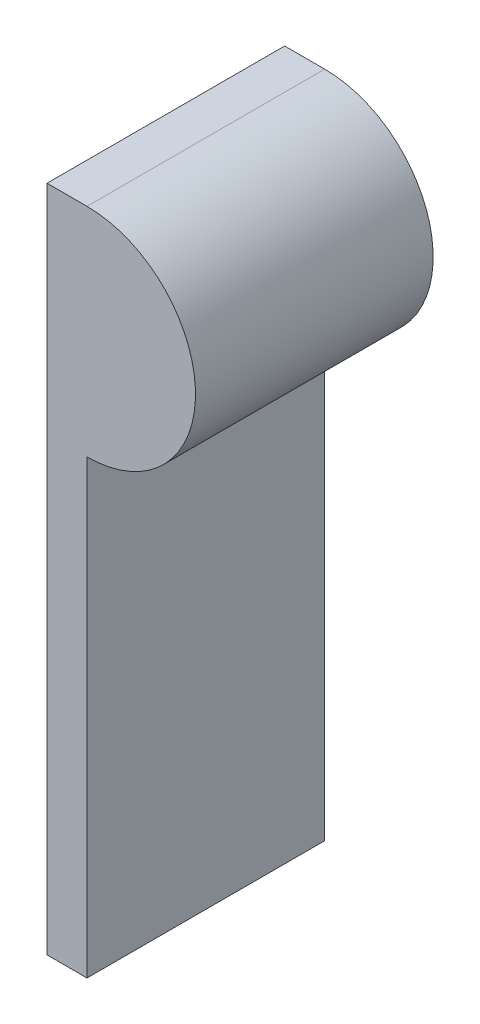
ISO-10303-21;
HEADER;
FILE_DESCRIPTION(('STEP AP214'),'2;1');
FILE_NAME('part.step','',(''),(''),'','','');
FILE_SCHEMA(('AUTOMOTIVE_DESIGN { 1 0 10303 214 1 1 1 1 }'));
ENDSEC;
DATA;
#1=APPLICATION_CONTEXT('core data for automotive mechanical design processes');
#2=APPLICATION_PROTOCOL_DEFINITION('international standard','automotive_design',2000,#1);
#3=PRODUCT_CONTEXT('',#1,'mechanical');
#4=PRODUCT('Part','Part','',(#3));
#5=PRODUCT_RELATED_PRODUCT_CATEGORY('part','',(#4));
#6=PRODUCT_DEFINITION_FORMATION('','',#4);
#7=PRODUCT_DEFINITION_CONTEXT('part definition',#1,'design');
#8=PRODUCT_DEFINITION('design','',#6,#7);
#9=PRODUCT_DEFINITION_SHAPE('','',#8);
#10=(LENGTH_UNIT() NAMED_UNIT(*) SI_UNIT(.MILLI.,.METRE.));
#11=(NAMED_UNIT(*) PLANE_ANGLE_UNIT() SI_UNIT($,.RADIAN.));
#12=(NAMED_UNIT(*) SI_UNIT($,.STERADIAN.) SOLID_ANGLE_UNIT());
#13=UNCERTAINTY_MEASURE_WITH_UNIT(LENGTH_MEASURE(1.E-05),#10,'distance_accuracy_value','');
#14=(GEOMETRIC_REPRESENTATION_CONTEXT(3) GLOBAL_UNCERTAINTY_ASSIGNED_CONTEXT((#13)) GLOBAL_UNIT_ASSIGNED_CONTEXT((#10,
#11,#12)) REPRESENTATION_CONTEXT('',''));
#15=CARTESIAN_POINT('',(0.,0.,0.));
#16=DIRECTION('',(0.,0.,1.));
#17=DIRECTION('',(1.,0.,0.));
#18=AXIS2_PLACEMENT_3D('',#15,#16,#17);
#19=CARTESIAN_POINT('',(1.68355553240632,0.869085170183158,10.));
#20=DIRECTION('',(0.,1.,0.));
#21=DIRECTION('',(0.,0.,1.));
#22=AXIS2_PLACEMENT_3D('',#19,#20,#21);
#23=PLANE('',#22);
#24=DIRECTION('',(1.,0.,0.));
#25=VECTOR('',#24,1.);
#26=CARTESIAN_POINT('',(1.68355553240632,0.869085170183158,0.));
#27=LINE('',#26,#25);
#28=CARTESIAN_POINT('',(0.,0.869085170183158,0.));
#29=VERTEX_POINT('',#28);
#30=CARTESIAN_POINT('',(1.68355553240632,0.869085170183158,0.));
#31=VERTEX_POINT('',#30);
#32=EDGE_CURVE('E111',#29,#31,#27,.T.);
#33=ORIENTED_EDGE('',*,*,#32,.T.);
#34=DIRECTION('',(0.,0.,-1.));
#35=VECTOR('',#34,1.);
#36=CARTESIAN_POINT('',(1.68355553240632,0.869085170183158,10.));
#37=LINE('',#36,#35);
#38=CARTESIAN_POINT('',(1.68355553240632,0.869085170183158,10.));
#39=VERTEX_POINT('',#38);
#40=EDGE_CURVE('E11',#39,#31,#37,.T.);
#41=ORIENTED_EDGE('',*,*,#40,.F.);
#42=DIRECTION('',(1.,0.,0.));
#43=VECTOR('',#42,1.);
#44=CARTESIAN_POINT('',(1.68355553240632,0.869085170183158,10.));
#45=LINE('',#44,#43);
#46=CARTESIAN_POINT('',(0.,0.869085170183158,10.));
#47=VERTEX_POINT('',#46);
#48=EDGE_CURVE('E119',#47,#39,#45,.T.);
#49=ORIENTED_EDGE('',*,*,#48,.F.);
#50=DIRECTION('',(0.,0.,-1.));
#51=VECTOR('',#50,1.);
#52=CARTESIAN_POINT('',(0.,0.869085170183158,10.));
#53=LINE('',#52,#51);
#54=EDGE_CURVE('E107',#47,#29,#53,.T.);
#55=ORIENTED_EDGE('',*,*,#54,.T.);
#56=EDGE_LOOP('',(#33,#41,#49,#55));
#57=FACE_BOUND('',#56,.T.);
#58=ADVANCED_FACE('F37',(#57),#23,.F.);
#59=CARTESIAN_POINT('',(1.68355553240632,19.8582064012595,10.));
#60=DIRECTION('',(-1.,0.,0.));
#61=DIRECTION('',(0.,0.,1.));
#62=AXIS2_PLACEMENT_3D('',#59,#60,#61);
#63=PLANE('',#62);
#64=DIRECTION('',(0.,1.,0.));
#65=VECTOR('',#64,1.);
#66=CARTESIAN_POINT('',(1.68355553240632,19.8582064012595,0.));
#67=LINE('',#66,#65);
#68=CARTESIAN_POINT('',(1.68355553240632,19.8582064012595,0.));
#69=VERTEX_POINT('',#68);
#70=EDGE_CURVE('E114',#31,#69,#67,.T.);
#71=ORIENTED_EDGE('',*,*,#70,.T.);
#72=DIRECTION('',(0.,0.,-1.));
#73=VECTOR('',#72,1.);
#74=CARTESIAN_POINT('',(1.68355553240632,19.8582064012595,10.));
#75=LINE('',#74,#73);
#76=CARTESIAN_POINT('',(1.68355553240632,19.8582064012595,10.));
#77=VERTEX_POINT('',#76);
#78=EDGE_CURVE('E45',#77,#69,#75,.T.);
#79=ORIENTED_EDGE('',*,*,#78,.F.);
#80=DIRECTION('',(0.,1.,0.));
#81=VECTOR('',#80,1.);
#82=CARTESIAN_POINT('',(1.68355553240632,19.8582064012595,10.));
#83=LINE('',#82,#81);
#84=EDGE_CURVE('E87',#39,#77,#83,.T.);
#85=ORIENTED_EDGE('',*,*,#84,.F.);
#86=ORIENTED_EDGE('',*,*,#40,.T.);
#87=EDGE_LOOP('',(#71,#79,#85,#86));
#88=FACE_BOUND('',#87,.T.);
#89=ADVANCED_FACE('F138',(#88),#63,.F.);
#90=CARTESIAN_POINT('',(1.68355553240632,24.4224445874047,10.));
#91=DIRECTION('',(0.,0.,-1.));
#92=DIRECTION('',(-1.,0.,0.));
#93=AXIS2_PLACEMENT_3D('',#90,#91,#92);
#94=CYLINDRICAL_SURFACE('',#93,4.56423818614522);
#95=CARTESIAN_POINT('',(1.68355553240632,24.4224445874047,0.));
#96=DIRECTION('',(0.,0.,1.));
#97=DIRECTION('',(-1.,0.,0.));
#98=AXIS2_PLACEMENT_3D('',#95,#96,#97);
#99=CIRCLE('',#98,4.56423818614522);
#100=CARTESIAN_POINT('',(1.68355553240632,28.9866827735499,0.));
#101=VERTEX_POINT('',#100);
#102=EDGE_CURVE('E102',#69,#101,#99,.T.);
#103=ORIENTED_EDGE('',*,*,#102,.T.);
#104=DIRECTION('',(0.,0.,-1.));
#105=VECTOR('',#104,1.);
#106=CARTESIAN_POINT('',(1.68355553240632,28.9866827735499,10.));
#107=LINE('',#106,#105);
#108=CARTESIAN_POINT('',(1.68355553240632,28.9866827735499,10.));
#109=VERTEX_POINT('',#108);
#110=EDGE_CURVE('E99',#109,#101,#107,.T.);
#111=ORIENTED_EDGE('',*,*,#110,.F.);
#112=CARTESIAN_POINT('',(1.68355553240632,24.4224445874047,10.));
#113=DIRECTION('',(0.,0.,1.));
#114=DIRECTION('',(-1.,0.,0.));
#115=AXIS2_PLACEMENT_3D('',#112,#113,#114);
#116=CIRCLE('',#115,4.56423818614522);
#117=EDGE_CURVE('E91',#77,#109,#116,.T.);
#118=ORIENTED_EDGE('',*,*,#117,.F.);
#119=ORIENTED_EDGE('',*,*,#78,.T.);
#120=EDGE_LOOP('',(#103,#111,#118,#119));
#121=FACE_BOUND('',#120,.T.);
#122=ADVANCED_FACE('F100',(#121),#94,.T.);
#123=CARTESIAN_POINT('',(0.,28.9866827735499,10.));
#124=DIRECTION('',(0.,-1.,0.));
#125=DIRECTION('',(0.,0.,-1.));
#126=AXIS2_PLACEMENT_3D('',#123,#124,#125);
#127=PLANE('',#126);
#128=DIRECTION('',(-1.,0.,0.));
#129=VECTOR('',#128,1.);
#130=CARTESIAN_POINT('',(0.,28.9866827735499,0.));
#131=LINE('',#130,#129);
#132=CARTESIAN_POINT('',(0.,28.9866827735499,0.));
#133=VERTEX_POINT('',#132);
#134=EDGE_CURVE('E73',#101,#133,#131,.T.);
#135=ORIENTED_EDGE('',*,*,#134,.T.);
#136=DIRECTION('',(0.,0.,-1.));
#137=VECTOR('',#136,1.);
#138=CARTESIAN_POINT('',(0.,28.9866827735499,10.));
#139=LINE('',#138,#137);
#140=CARTESIAN_POINT('',(0.,28.9866827735499,10.));
#141=VERTEX_POINT('',#140);
#142=EDGE_CURVE('E103',#141,#133,#139,.T.);
#143=ORIENTED_EDGE('',*,*,#142,.F.);
#144=DIRECTION('',(-1.,0.,0.));
#145=VECTOR('',#144,1.);
#146=CARTESIAN_POINT('',(0.,28.9866827735499,10.));
#147=LINE('',#146,#145);
#148=EDGE_CURVE('E95',#109,#141,#147,.T.);
#149=ORIENTED_EDGE('',*,*,#148,.F.);
#150=ORIENTED_EDGE('',*,*,#110,.T.);
#151=EDGE_LOOP('',(#135,#143,#149,#150));
#152=FACE_BOUND('',#151,.T.);
#153=ADVANCED_FACE('F105',(#152),#127,.F.);
#154=CARTESIAN_POINT('',(0.,0.869085170183158,10.));
#155=DIRECTION('',(1.,0.,0.));
#156=DIRECTION('',(0.,0.,-1.));
#157=AXIS2_PLACEMENT_3D('',#154,#155,#156);
#158=PLANE('',#157);
#159=DIRECTION('',(0.,-1.,0.));
#160=VECTOR('',#159,1.);
#161=CARTESIAN_POINT('',(0.,0.869085170183158,0.));
#162=LINE('',#161,#160);
#163=EDGE_CURVE('E79',#133,#29,#162,.T.);
#164=ORIENTED_EDGE('',*,*,#163,.T.);
#165=ORIENTED_EDGE('',*,*,#54,.F.);
#166=DIRECTION('',(0.,-1.,0.));
#167=VECTOR('',#166,1.);
#168=CARTESIAN_POINT('',(0.,0.869085170183158,10.));
#169=LINE('',#168,#167);
#170=EDGE_CURVE('E53',#141,#47,#169,.T.);
#171=ORIENTED_EDGE('',*,*,#170,.F.);
#172=ORIENTED_EDGE('',*,*,#142,.T.);
#173=EDGE_LOOP('',(#164,#165,#171,#172));
#174=FACE_BOUND('',#173,.T.);
#175=ADVANCED_FACE('F127',(#174),#158,.F.);
#176=CARTESIAN_POINT('',(1.68355553240632,24.4224445874047,10.));
#177=DIRECTION('',(0.,0.,-1.));
#178=DIRECTION('',(-1.,0.,0.));
#179=AXIS2_PLACEMENT_3D('',#176,#177,#178);
#180=PLANE('',#179);
#181=ORIENTED_EDGE('',*,*,#48,.T.);
#182=ORIENTED_EDGE('',*,*,#84,.T.);
#183=ORIENTED_EDGE('',*,*,#117,.T.);
#184=ORIENTED_EDGE('',*,*,#148,.T.);
#185=ORIENTED_EDGE('',*,*,#170,.T.);
#186=EDGE_LOOP('',(#181,#182,#183,#184,#185));
#187=FACE_BOUND('',#186,.T.);
#188=ADVANCED_FACE('F93',(#187),#180,.F.);
#189=CARTESIAN_POINT('',(1.68355553240632,24.4224445874047,0.));
#190=DIRECTION('',(0.,0.,-1.));
#191=DIRECTION('',(-1.,0.,0.));
#192=AXIS2_PLACEMENT_3D('',#189,#190,#191);
#193=PLANE('',#192);
#194=ORIENTED_EDGE('',*,*,#32,.F.);
#195=ORIENTED_EDGE('',*,*,#163,.F.);
#196=ORIENTED_EDGE('',*,*,#134,.F.);
#197=ORIENTED_EDGE('',*,*,#102,.F.);
#198=ORIENTED_EDGE('',*,*,#70,.F.);
#199=EDGE_LOOP('',(#194,#195,#196,#197,#198));
#200=FACE_BOUND('',#199,.T.);
#201=ADVANCED_FACE('F123',(#200),#193,.T.);
#202=CLOSED_SHELL('',(#58,#89,#122,#153,#175,#188,#201));
#203=MANIFOLD_SOLID_BREP('B2',#202);
#204=ADVANCED_BREP_SHAPE_REPRESENTATION('',(#18,#203),#14);
#205=SHAPE_DEFINITION_REPRESENTATION(#9,#204);
ENDSEC;
END-ISO-10303-21;
